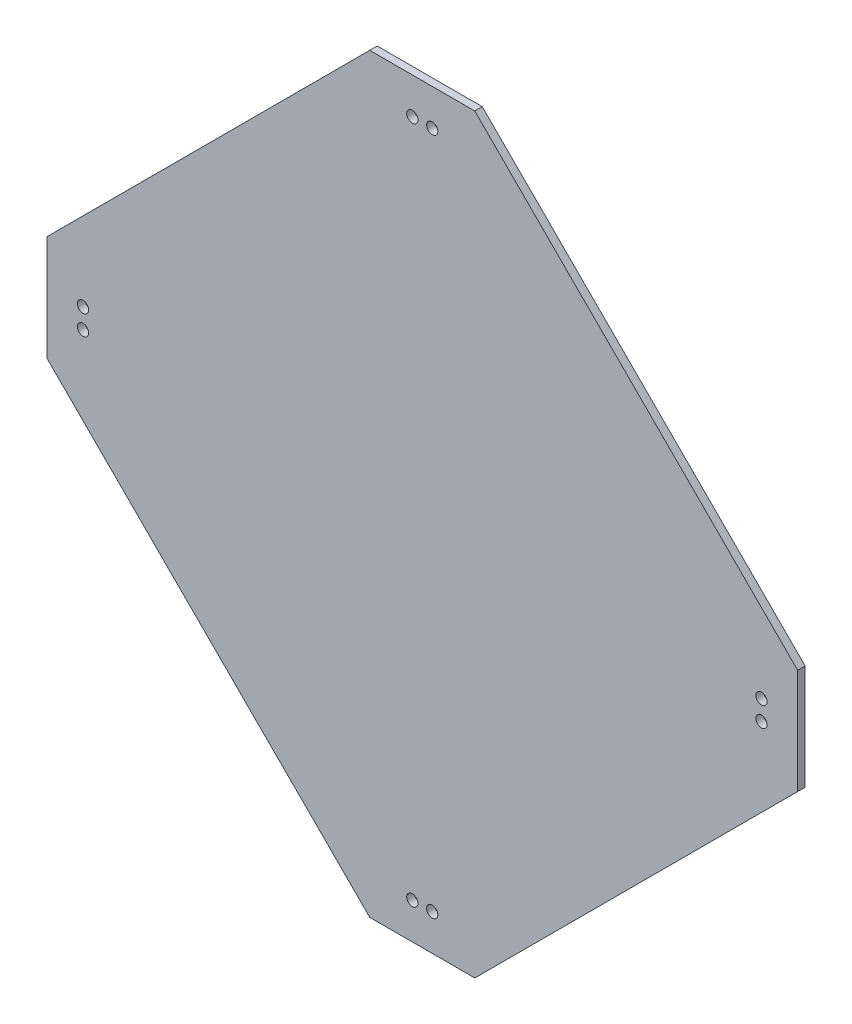
ISO-10303-21;
HEADER;
FILE_DESCRIPTION(('STEP AP214'),'2;1');
FILE_NAME('part.step','',(''),(''),'','','');
FILE_SCHEMA(('AUTOMOTIVE_DESIGN { 1 0 10303 214 1 1 1 1 }'));
ENDSEC;
DATA;
#1=APPLICATION_CONTEXT('core data for automotive mechanical design processes');
#2=APPLICATION_PROTOCOL_DEFINITION('international standard','automotive_design',2000,#1);
#3=PRODUCT_CONTEXT('',#1,'mechanical');
#4=PRODUCT('Part','Part','',(#3));
#5=PRODUCT_RELATED_PRODUCT_CATEGORY('part','',(#4));
#6=PRODUCT_DEFINITION_FORMATION('','',#4);
#7=PRODUCT_DEFINITION_CONTEXT('part definition',#1,'design');
#8=PRODUCT_DEFINITION('design','',#6,#7);
#9=PRODUCT_DEFINITION_SHAPE('','',#8);
#10=(LENGTH_UNIT() NAMED_UNIT(*) SI_UNIT(.MILLI.,.METRE.));
#11=(NAMED_UNIT(*) PLANE_ANGLE_UNIT() SI_UNIT($,.RADIAN.));
#12=(NAMED_UNIT(*) SI_UNIT($,.STERADIAN.) SOLID_ANGLE_UNIT());
#13=UNCERTAINTY_MEASURE_WITH_UNIT(LENGTH_MEASURE(1.E-05),#10,'distance_accuracy_value','');
#14=(GEOMETRIC_REPRESENTATION_CONTEXT(3) GLOBAL_UNCERTAINTY_ASSIGNED_CONTEXT((#13)) GLOBAL_UNIT_ASSIGNED_CONTEXT((#10,
#11,#12)) REPRESENTATION_CONTEXT('',''));
#15=CARTESIAN_POINT('',(0.,0.,0.));
#16=DIRECTION('',(0.,0.,1.));
#17=DIRECTION('',(1.,0.,0.));
#18=AXIS2_PLACEMENT_3D('',#15,#16,#17);
#19=CARTESIAN_POINT('',(0.,0.,3.));
#20=DIRECTION('',(0.,0.,-1.));
#21=DIRECTION('',(-1.,0.,0.));
#22=AXIS2_PLACEMENT_3D('',#19,#20,#21);
#23=PLANE('',#22);
#24=DIRECTION('',(-0.707106781186544,0.707106781186551,0.));
#25=VECTOR('',#24,1.);
#26=CARTESIAN_POINT('',(75.9816589394957,-12.9282003511903,3.));
#27=LINE('',#26,#25);
#28=CARTESIAN_POINT('',(205.297418483575,-142.243959895271,3.));
#29=VERTEX_POINT('',#28);
#30=CARTESIAN_POINT('',(75.9816589394957,-12.9282003511903,3.));
#31=VERTEX_POINT('',#30);
#32=EDGE_CURVE('E173',#29,#31,#27,.T.);
#33=ORIENTED_EDGE('',*,*,#32,.T.);
#34=DIRECTION('',(-1.,0.,0.));
#35=VECTOR('',#34,1.);
#36=CARTESIAN_POINT('',(33.9205491705568,-12.9282003511903,3.));
#37=LINE('',#36,#35);
#38=CARTESIAN_POINT('',(33.9205491705568,-12.9282003511903,3.));
#39=VERTEX_POINT('',#38);
#40=EDGE_CURVE('E80',#31,#39,#37,.T.);
#41=ORIENTED_EDGE('',*,*,#40,.T.);
#42=DIRECTION('',(-0.707106781186551,-0.707106781186544,0.));
#43=VECTOR('',#42,1.);
#44=CARTESIAN_POINT('',(-30.7373306014837,-77.5860801232302,3.));
#45=LINE('',#44,#43);
#46=CARTESIAN_POINT('',(-95.3952103735244,-142.24395989527,3.));
#47=VERTEX_POINT('',#46);
#48=EDGE_CURVE('E125',#39,#47,#45,.T.);
#49=ORIENTED_EDGE('',*,*,#48,.T.);
#50=DIRECTION('',(0.,1.,0.));
#51=VECTOR('',#50,1.);
#52=CARTESIAN_POINT('',(-95.3952103735244,-142.24395989527,3.));
#53=LINE('',#52,#51);
#54=CARTESIAN_POINT('',(-95.3952103735248,-184.305069664209,3.));
#55=VERTEX_POINT('',#54);
#56=EDGE_CURVE('E110',#55,#47,#53,.T.);
#57=ORIENTED_EDGE('',*,*,#56,.F.);
#58=DIRECTION('',(-0.707106781186544,0.707106781186551,0.));
#59=VECTOR('',#58,1.);
#60=CARTESIAN_POINT('',(-95.3952103735248,-184.305069664209,3.));
#61=LINE('',#60,#59);
#62=CARTESIAN_POINT('',(33.9205491705543,-313.620829208289,3.));
#63=VERTEX_POINT('',#62);
#64=EDGE_CURVE('E123',#63,#55,#61,.T.);
#65=ORIENTED_EDGE('',*,*,#64,.F.);
#66=DIRECTION('',(-1.,0.,0.));
#67=VECTOR('',#66,1.);
#68=CARTESIAN_POINT('',(33.9205491705543,-313.620829208289,3.));
#69=LINE('',#68,#67);
#70=CARTESIAN_POINT('',(75.9816589394932,-313.62082920829,3.));
#71=VERTEX_POINT('',#70);
#72=EDGE_CURVE('E127',#71,#63,#69,.T.);
#73=ORIENTED_EDGE('',*,*,#72,.F.);
#74=DIRECTION('',(0.707106781186551,0.707106781186544,0.));
#75=VECTOR('',#74,1.);
#76=CARTESIAN_POINT('',(205.297418483575,-184.305069664209,3.));
#77=LINE('',#76,#75);
#78=CARTESIAN_POINT('',(205.297418483575,-184.305069664209,3.));
#79=VERTEX_POINT('',#78);
#80=EDGE_CURVE('E177',#71,#79,#77,.T.);
#81=ORIENTED_EDGE('',*,*,#80,.T.);
#82=DIRECTION('',(0.,1.,0.));
#83=VECTOR('',#82,1.);
#84=CARTESIAN_POINT('',(205.297418483575,-142.243959895271,3.));
#85=LINE('',#84,#83);
#86=EDGE_CURVE('E49',#79,#29,#85,.T.);
#87=ORIENTED_EDGE('',*,*,#86,.T.);
#88=EDGE_LOOP('',(#33,#41,#49,#57,#65,#73,#81,#87));
#89=FACE_BOUND('',#88,.T.);
#90=CARTESIAN_POINT('',(50.9711543065999,-27.4282003511903,3.));
#91=DIRECTION('',(0.,0.,1.));
#92=DIRECTION('',(1.,0.,0.));
#93=AXIS2_PLACEMENT_3D('',#90,#91,#92);
#94=CIRCLE('',#93,2.25);
#95=CARTESIAN_POINT('',(53.2211543065999,-27.4282003511903,3.));
#96=VERTEX_POINT('',#95);
#97=EDGE_CURVE('E167',#96,#96,#94,.T.);
#98=ORIENTED_EDGE('',*,*,#97,.F.);
#99=EDGE_LOOP('',(#98));
#100=FACE_BOUND('',#99,.T.);
#101=CARTESIAN_POINT('',(58.9310538034528,-27.4282003511903,3.));
#102=DIRECTION('',(0.,0.,1.));
#103=DIRECTION('',(1.,0.,0.));
#104=AXIS2_PLACEMENT_3D('',#101,#102,#103);
#105=CIRCLE('',#104,2.25);
#106=CARTESIAN_POINT('',(61.1810538034528,-27.4282003511903,3.));
#107=VERTEX_POINT('',#106);
#108=EDGE_CURVE('E161',#107,#107,#105,.T.);
#109=ORIENTED_EDGE('',*,*,#108,.F.);
#110=EDGE_LOOP('',(#109));
#111=FACE_BOUND('',#110,.T.);
#112=CARTESIAN_POINT('',(190.797418483575,-167.254464528167,3.));
#113=DIRECTION('',(0.,0.,1.));
#114=DIRECTION('',(1.,0.,0.));
#115=AXIS2_PLACEMENT_3D('',#112,#113,#114);
#116=CIRCLE('',#115,2.25000000000001);
#117=CARTESIAN_POINT('',(193.047418483575,-167.254464528167,3.));
#118=VERTEX_POINT('',#117);
#119=EDGE_CURVE('E155',#118,#118,#116,.T.);
#120=ORIENTED_EDGE('',*,*,#119,.F.);
#121=EDGE_LOOP('',(#120));
#122=FACE_BOUND('',#121,.T.);
#123=CARTESIAN_POINT('',(190.797418483575,-159.294565031314,3.));
#124=DIRECTION('',(0.,0.,1.));
#125=DIRECTION('',(1.,0.,0.));
#126=AXIS2_PLACEMENT_3D('',#123,#124,#125);
#127=CIRCLE('',#126,2.25000000000001);
#128=CARTESIAN_POINT('',(193.047418483575,-159.294565031314,3.));
#129=VERTEX_POINT('',#128);
#130=EDGE_CURVE('E149',#129,#129,#127,.T.);
#131=ORIENTED_EDGE('',*,*,#130,.F.);
#132=EDGE_LOOP('',(#131));
#133=FACE_BOUND('',#132,.T.);
#134=CARTESIAN_POINT('',(-80.8952103735245,-159.294565031313,3.));
#135=DIRECTION('',(0.,0.,-1.));
#136=DIRECTION('',(0.,-1.,0.));
#137=AXIS2_PLACEMENT_3D('',#134,#135,#136);
#138=CIRCLE('',#137,2.25);
#139=CARTESIAN_POINT('',(-80.8952103735246,-161.544565031313,3.));
#140=VERTEX_POINT('',#139);
#141=EDGE_CURVE('E143',#140,#140,#138,.T.);
#142=ORIENTED_EDGE('',*,*,#141,.T.);
#143=EDGE_LOOP('',(#142));
#144=FACE_BOUND('',#143,.T.);
#145=CARTESIAN_POINT('',(-80.8952103735246,-167.254464528166,3.));
#146=DIRECTION('',(0.,0.,-1.));
#147=DIRECTION('',(0.,-1.,0.));
#148=AXIS2_PLACEMENT_3D('',#145,#146,#147);
#149=CIRCLE('',#148,2.25);
#150=CARTESIAN_POINT('',(-80.8952103735246,-169.504464528166,3.));
#151=VERTEX_POINT('',#150);
#152=EDGE_CURVE('E398',#151,#151,#149,.T.);
#153=ORIENTED_EDGE('',*,*,#152,.T.);
#154=EDGE_LOOP('',(#153));
#155=FACE_BOUND('',#154,.T.);
#156=CARTESIAN_POINT('',(58.9310538034504,-299.12082920829,3.));
#157=DIRECTION('',(0.,0.,-1.));
#158=DIRECTION('',(0.,-1.,0.));
#159=AXIS2_PLACEMENT_3D('',#156,#157,#158);
#160=CIRCLE('',#159,2.25000000000001);
#161=CARTESIAN_POINT('',(58.9310538034504,-301.37082920829,3.));
#162=VERTEX_POINT('',#161);
#163=EDGE_CURVE('E392',#162,#162,#160,.T.);
#164=ORIENTED_EDGE('',*,*,#163,.T.);
#165=EDGE_LOOP('',(#164));
#166=FACE_BOUND('',#165,.T.);
#167=CARTESIAN_POINT('',(50.9711543065975,-299.12082920829,3.));
#168=DIRECTION('',(0.,0.,-1.));
#169=DIRECTION('',(0.,-1.,0.));
#170=AXIS2_PLACEMENT_3D('',#167,#168,#169);
#171=CIRCLE('',#170,2.25000000000001);
#172=CARTESIAN_POINT('',(50.9711543065975,-301.37082920829,3.));
#173=VERTEX_POINT('',#172);
#174=EDGE_CURVE('E383',#173,#173,#171,.T.);
#175=ORIENTED_EDGE('',*,*,#174,.T.);
#176=EDGE_LOOP('',(#175));
#177=FACE_BOUND('',#176,.T.);
#178=ADVANCED_FACE('F32',(#89,#100,#111,#122,#133,#144,#155,#166,#177),#23,.F.);
#179=CARTESIAN_POINT('',(0.,0.,0.));
#180=DIRECTION('',(0.,0.,-1.));
#181=DIRECTION('',(-1.,0.,0.));
#182=AXIS2_PLACEMENT_3D('',#179,#180,#181);
#183=PLANE('',#182);
#184=CARTESIAN_POINT('',(190.797418483575,-167.254464528167,0.));
#185=DIRECTION('',(0.,0.,1.));
#186=DIRECTION('',(1.,0.,0.));
#187=AXIS2_PLACEMENT_3D('',#184,#185,#186);
#188=CIRCLE('',#187,2.25000000000001);
#189=CARTESIAN_POINT('',(193.047418483575,-167.254464528167,0.));
#190=VERTEX_POINT('',#189);
#191=EDGE_CURVE('E152',#190,#190,#188,.T.);
#192=ORIENTED_EDGE('',*,*,#191,.T.);
#193=EDGE_LOOP('',(#192));
#194=FACE_BOUND('',#193,.T.);
#195=CARTESIAN_POINT('',(50.9711543065999,-27.4282003511903,0.));
#196=DIRECTION('',(0.,0.,1.));
#197=DIRECTION('',(1.,0.,0.));
#198=AXIS2_PLACEMENT_3D('',#195,#196,#197);
#199=CIRCLE('',#198,2.25);
#200=CARTESIAN_POINT('',(53.2211543065999,-27.4282003511903,0.));
#201=VERTEX_POINT('',#200);
#202=EDGE_CURVE('E164',#201,#201,#199,.T.);
#203=ORIENTED_EDGE('',*,*,#202,.T.);
#204=EDGE_LOOP('',(#203));
#205=FACE_BOUND('',#204,.T.);
#206=DIRECTION('',(-0.707106781186544,0.707106781186551,0.));
#207=VECTOR('',#206,1.);
#208=CARTESIAN_POINT('',(75.9816589394957,-12.9282003511903,0.));
#209=LINE('',#208,#207);
#210=CARTESIAN_POINT('',(205.297418483575,-142.243959895271,0.));
#211=VERTEX_POINT('',#210);
#212=CARTESIAN_POINT('',(75.9816589394957,-12.9282003511903,0.));
#213=VERTEX_POINT('',#212);
#214=EDGE_CURVE('E170',#211,#213,#209,.T.);
#215=ORIENTED_EDGE('',*,*,#214,.F.);
#216=DIRECTION('',(0.,1.,0.));
#217=VECTOR('',#216,1.);
#218=CARTESIAN_POINT('',(205.297418483575,-142.243959895271,0.));
#219=LINE('',#218,#217);
#220=CARTESIAN_POINT('',(205.297418483575,-184.305069664209,0.));
#221=VERTEX_POINT('',#220);
#222=EDGE_CURVE('E73',#221,#211,#219,.T.);
#223=ORIENTED_EDGE('',*,*,#222,.F.);
#224=DIRECTION('',(0.707106781186551,0.707106781186544,0.));
#225=VECTOR('',#224,1.);
#226=CARTESIAN_POINT('',(205.297418483575,-184.305069664209,0.));
#227=LINE('',#226,#225);
#228=CARTESIAN_POINT('',(75.9816589394932,-313.62082920829,0.));
#229=VERTEX_POINT('',#228);
#230=EDGE_CURVE('E67',#229,#221,#227,.T.);
#231=ORIENTED_EDGE('',*,*,#230,.F.);
#232=DIRECTION('',(-1.,0.,0.));
#233=VECTOR('',#232,1.);
#234=CARTESIAN_POINT('',(33.9205491705543,-313.620829208289,0.));
#235=LINE('',#234,#233);
#236=CARTESIAN_POINT('',(33.9205491705543,-313.620829208289,0.));
#237=VERTEX_POINT('',#236);
#238=EDGE_CURVE('E132',#229,#237,#235,.T.);
#239=ORIENTED_EDGE('',*,*,#238,.T.);
#240=DIRECTION('',(-0.707106781186544,0.707106781186551,0.));
#241=VECTOR('',#240,1.);
#242=CARTESIAN_POINT('',(-95.3952103735248,-184.305069664209,0.));
#243=LINE('',#242,#241);
#244=CARTESIAN_POINT('',(-95.3952103735248,-184.305069664209,0.));
#245=VERTEX_POINT('',#244);
#246=EDGE_CURVE('E141',#237,#245,#243,.T.);
#247=ORIENTED_EDGE('',*,*,#246,.T.);
#248=DIRECTION('',(0.,1.,0.));
#249=VECTOR('',#248,1.);
#250=CARTESIAN_POINT('',(-95.3952103735244,-142.24395989527,0.));
#251=LINE('',#250,#249);
#252=CARTESIAN_POINT('',(-95.3952103735244,-142.24395989527,0.));
#253=VERTEX_POINT('',#252);
#254=EDGE_CURVE('E112',#245,#253,#251,.T.);
#255=ORIENTED_EDGE('',*,*,#254,.T.);
#256=DIRECTION('',(-0.707106781186551,-0.707106781186544,0.));
#257=VECTOR('',#256,1.);
#258=CARTESIAN_POINT('',(-30.7373306014837,-77.5860801232302,0.));
#259=LINE('',#258,#257);
#260=CARTESIAN_POINT('',(33.9205491705568,-12.9282003511903,0.));
#261=VERTEX_POINT('',#260);
#262=EDGE_CURVE('E185',#261,#253,#259,.T.);
#263=ORIENTED_EDGE('',*,*,#262,.F.);
#264=DIRECTION('',(-1.,0.,0.));
#265=VECTOR('',#264,1.);
#266=CARTESIAN_POINT('',(33.9205491705568,-12.9282003511903,0.));
#267=LINE('',#266,#265);
#268=EDGE_CURVE('E183',#213,#261,#267,.T.);
#269=ORIENTED_EDGE('',*,*,#268,.F.);
#270=EDGE_LOOP('',(#215,#223,#231,#239,#247,#255,#263,#269));
#271=FACE_BOUND('',#270,.T.);
#272=CARTESIAN_POINT('',(58.9310538034528,-27.4282003511903,0.));
#273=DIRECTION('',(0.,0.,1.));
#274=DIRECTION('',(1.,0.,0.));
#275=AXIS2_PLACEMENT_3D('',#272,#273,#274);
#276=CIRCLE('',#275,2.25);
#277=CARTESIAN_POINT('',(61.1810538034528,-27.4282003511903,0.));
#278=VERTEX_POINT('',#277);
#279=EDGE_CURVE('E158',#278,#278,#276,.T.);
#280=ORIENTED_EDGE('',*,*,#279,.T.);
#281=EDGE_LOOP('',(#280));
#282=FACE_BOUND('',#281,.T.);
#283=CARTESIAN_POINT('',(190.797418483575,-159.294565031314,0.));
#284=DIRECTION('',(0.,0.,1.));
#285=DIRECTION('',(1.,0.,0.));
#286=AXIS2_PLACEMENT_3D('',#283,#284,#285);
#287=CIRCLE('',#286,2.25000000000001);
#288=CARTESIAN_POINT('',(193.047418483575,-159.294565031314,0.));
#289=VERTEX_POINT('',#288);
#290=EDGE_CURVE('E117',#289,#289,#287,.T.);
#291=ORIENTED_EDGE('',*,*,#290,.T.);
#292=EDGE_LOOP('',(#291));
#293=FACE_BOUND('',#292,.T.);
#294=CARTESIAN_POINT('',(58.9310538034504,-299.12082920829,0.));
#295=DIRECTION('',(0.,0.,-1.));
#296=DIRECTION('',(0.,-1.,0.));
#297=AXIS2_PLACEMENT_3D('',#294,#295,#296);
#298=CIRCLE('',#297,2.25000000000001);
#299=CARTESIAN_POINT('',(58.9310538034504,-301.37082920829,0.));
#300=VERTEX_POINT('',#299);
#301=EDGE_CURVE('E389',#300,#300,#298,.T.);
#302=ORIENTED_EDGE('',*,*,#301,.F.);
#303=EDGE_LOOP('',(#302));
#304=FACE_BOUND('',#303,.T.);
#305=CARTESIAN_POINT('',(-80.8952103735245,-159.294565031313,0.));
#306=DIRECTION('',(0.,0.,-1.));
#307=DIRECTION('',(0.,-1.,0.));
#308=AXIS2_PLACEMENT_3D('',#305,#306,#307);
#309=CIRCLE('',#308,2.25);
#310=CARTESIAN_POINT('',(-80.8952103735246,-161.544565031313,0.));
#311=VERTEX_POINT('',#310);
#312=EDGE_CURVE('E137',#311,#311,#309,.T.);
#313=ORIENTED_EDGE('',*,*,#312,.F.);
#314=EDGE_LOOP('',(#313));
#315=FACE_BOUND('',#314,.T.);
#316=CARTESIAN_POINT('',(-80.8952103735246,-167.254464528166,0.));
#317=DIRECTION('',(0.,0.,-1.));
#318=DIRECTION('',(0.,-1.,0.));
#319=AXIS2_PLACEMENT_3D('',#316,#317,#318);
#320=CIRCLE('',#319,2.25);
#321=CARTESIAN_POINT('',(-80.8952103735246,-169.504464528166,0.));
#322=VERTEX_POINT('',#321);
#323=EDGE_CURVE('E395',#322,#322,#320,.T.);
#324=ORIENTED_EDGE('',*,*,#323,.F.);
#325=EDGE_LOOP('',(#324));
#326=FACE_BOUND('',#325,.T.);
#327=CARTESIAN_POINT('',(50.9711543065975,-299.12082920829,0.));
#328=DIRECTION('',(0.,0.,-1.));
#329=DIRECTION('',(0.,-1.,0.));
#330=AXIS2_PLACEMENT_3D('',#327,#328,#329);
#331=CIRCLE('',#330,2.25000000000001);
#332=CARTESIAN_POINT('',(50.9711543065975,-301.37082920829,0.));
#333=VERTEX_POINT('',#332);
#334=EDGE_CURVE('E386',#333,#333,#331,.T.);
#335=ORIENTED_EDGE('',*,*,#334,.F.);
#336=EDGE_LOOP('',(#335));
#337=FACE_BOUND('',#336,.T.);
#338=ADVANCED_FACE('F197',(#194,#205,#271,#282,#293,#304,#315,#326,#337),#183,.T.);
#339=CARTESIAN_POINT('',(75.9816589394957,-12.9282003511903,3.));
#340=DIRECTION('',(-0.707106781186551,-0.707106781186544,0.));
#341=DIRECTION('',(0.707106781186544,-0.707106781186551,0.));
#342=AXIS2_PLACEMENT_3D('',#339,#340,#341);
#343=PLANE('',#342);
#344=ORIENTED_EDGE('',*,*,#214,.T.);
#345=DIRECTION('',(0.,0.,-1.));
#346=VECTOR('',#345,1.);
#347=CARTESIAN_POINT('',(75.9816589394957,-12.9282003511903,3.));
#348=LINE('',#347,#346);
#349=EDGE_CURVE('E11',#31,#213,#348,.T.);
#350=ORIENTED_EDGE('',*,*,#349,.F.);
#351=ORIENTED_EDGE('',*,*,#32,.F.);
#352=DIRECTION('',(0.,0.,-1.));
#353=VECTOR('',#352,1.);
#354=CARTESIAN_POINT('',(205.297418483575,-142.243959895271,3.));
#355=LINE('',#354,#353);
#356=EDGE_CURVE('E180',#29,#211,#355,.T.);
#357=ORIENTED_EDGE('',*,*,#356,.T.);
#358=EDGE_LOOP('',(#344,#350,#351,#357));
#359=FACE_BOUND('',#358,.T.);
#360=ADVANCED_FACE('F34',(#359),#343,.F.);
#361=CARTESIAN_POINT('',(33.9205491705568,-12.9282003511903,3.));
#362=DIRECTION('',(0.,-1.,0.));
#363=DIRECTION('',(0.,0.,-1.));
#364=AXIS2_PLACEMENT_3D('',#361,#362,#363);
#365=PLANE('',#364);
#366=ORIENTED_EDGE('',*,*,#268,.T.);
#367=DIRECTION('',(0.,0.,-1.));
#368=VECTOR('',#367,1.);
#369=CARTESIAN_POINT('',(33.9205491705568,-12.9282003511903,3.));
#370=LINE('',#369,#368);
#371=EDGE_CURVE('E41',#39,#261,#370,.T.);
#372=ORIENTED_EDGE('',*,*,#371,.F.);
#373=ORIENTED_EDGE('',*,*,#40,.F.);
#374=ORIENTED_EDGE('',*,*,#349,.T.);
#375=EDGE_LOOP('',(#366,#372,#373,#374));
#376=FACE_BOUND('',#375,.T.);
#377=ADVANCED_FACE('F208',(#376),#365,.F.);
#378=CARTESIAN_POINT('',(-30.7373306014837,-77.5860801232302,3.));
#379=DIRECTION('',(0.707106781186544,-0.707106781186551,0.));
#380=DIRECTION('',(0.707106781186551,0.707106781186544,0.));
#381=AXIS2_PLACEMENT_3D('',#378,#379,#380);
#382=PLANE('',#381);
#383=ORIENTED_EDGE('',*,*,#262,.T.);
#384=DIRECTION('',(0.,0.,-1.));
#385=VECTOR('',#384,1.);
#386=CARTESIAN_POINT('',(-95.3952103735244,-142.24395989527,3.));
#387=LINE('',#386,#385);
#388=EDGE_CURVE('E118',#47,#253,#387,.T.);
#389=ORIENTED_EDGE('',*,*,#388,.F.);
#390=ORIENTED_EDGE('',*,*,#48,.F.);
#391=ORIENTED_EDGE('',*,*,#371,.T.);
#392=EDGE_LOOP('',(#383,#389,#390,#391));
#393=FACE_BOUND('',#392,.T.);
#394=ADVANCED_FACE('F194',(#393),#382,.F.);
#395=CARTESIAN_POINT('',(205.297418483575,-184.305069664209,3.));
#396=DIRECTION('',(-0.707106781186544,0.707106781186551,0.));
#397=DIRECTION('',(-0.707106781186551,-0.707106781186544,0.));
#398=AXIS2_PLACEMENT_3D('',#395,#396,#397);
#399=PLANE('',#398);
#400=ORIENTED_EDGE('',*,*,#230,.T.);
#401=DIRECTION('',(0.,0.,-1.));
#402=VECTOR('',#401,1.);
#403=CARTESIAN_POINT('',(205.297418483575,-184.305069664209,3.));
#404=LINE('',#403,#402);
#405=EDGE_CURVE('E190',#79,#221,#404,.T.);
#406=ORIENTED_EDGE('',*,*,#405,.F.);
#407=ORIENTED_EDGE('',*,*,#80,.F.);
#408=DIRECTION('',(0.,0.,-1.));
#409=VECTOR('',#408,1.);
#410=CARTESIAN_POINT('',(75.9816589394932,-313.62082920829,3.));
#411=LINE('',#410,#409);
#412=EDGE_CURVE('E146',#71,#229,#411,.T.);
#413=ORIENTED_EDGE('',*,*,#412,.T.);
#414=EDGE_LOOP('',(#400,#406,#407,#413));
#415=FACE_BOUND('',#414,.T.);
#416=ADVANCED_FACE('F203',(#415),#399,.F.);
#417=CARTESIAN_POINT('',(205.297418483575,-142.243959895271,3.));
#418=DIRECTION('',(-1.,0.,0.));
#419=DIRECTION('',(0.,0.,1.));
#420=AXIS2_PLACEMENT_3D('',#417,#418,#419);
#421=PLANE('',#420);
#422=ORIENTED_EDGE('',*,*,#222,.T.);
#423=ORIENTED_EDGE('',*,*,#356,.F.);
#424=ORIENTED_EDGE('',*,*,#86,.F.);
#425=ORIENTED_EDGE('',*,*,#405,.T.);
#426=EDGE_LOOP('',(#422,#423,#424,#425));
#427=FACE_BOUND('',#426,.T.);
#428=ADVANCED_FACE('F204',(#427),#421,.F.);
#429=CARTESIAN_POINT('',(50.9711543065999,-27.4282003511903,3.));
#430=DIRECTION('',(0.,0.,-1.));
#431=DIRECTION('',(-1.,0.,0.));
#432=AXIS2_PLACEMENT_3D('',#429,#430,#431);
#433=CYLINDRICAL_SURFACE('',#432,2.25);
#434=ORIENTED_EDGE('',*,*,#97,.T.);
#435=EDGE_LOOP('',(#434));
#436=FACE_BOUND('',#435,.T.);
#437=ORIENTED_EDGE('',*,*,#202,.F.);
#438=EDGE_LOOP('',(#437));
#439=FACE_BOUND('',#438,.T.);
#440=ADVANCED_FACE('F223',(#436,#439),#433,.F.);
#441=CARTESIAN_POINT('',(58.9310538034528,-27.4282003511903,3.));
#442=DIRECTION('',(0.,0.,-1.));
#443=DIRECTION('',(-1.,0.,0.));
#444=AXIS2_PLACEMENT_3D('',#441,#442,#443);
#445=CYLINDRICAL_SURFACE('',#444,2.25);
#446=ORIENTED_EDGE('',*,*,#108,.T.);
#447=EDGE_LOOP('',(#446));
#448=FACE_BOUND('',#447,.T.);
#449=ORIENTED_EDGE('',*,*,#279,.F.);
#450=EDGE_LOOP('',(#449));
#451=FACE_BOUND('',#450,.T.);
#452=ADVANCED_FACE('F245',(#448,#451),#445,.F.);
#453=CARTESIAN_POINT('',(190.797418483575,-167.254464528167,3.));
#454=DIRECTION('',(0.,0.,-1.));
#455=DIRECTION('',(-1.,0.,0.));
#456=AXIS2_PLACEMENT_3D('',#453,#454,#455);
#457=CYLINDRICAL_SURFACE('',#456,2.25000000000001);
#458=ORIENTED_EDGE('',*,*,#119,.T.);
#459=EDGE_LOOP('',(#458));
#460=FACE_BOUND('',#459,.T.);
#461=ORIENTED_EDGE('',*,*,#191,.F.);
#462=EDGE_LOOP('',(#461));
#463=FACE_BOUND('',#462,.T.);
#464=ADVANCED_FACE('F254',(#460,#463),#457,.F.);
#465=CARTESIAN_POINT('',(190.797418483575,-159.294565031314,3.));
#466=DIRECTION('',(0.,0.,-1.));
#467=DIRECTION('',(-1.,0.,0.));
#468=AXIS2_PLACEMENT_3D('',#465,#466,#467);
#469=CYLINDRICAL_SURFACE('',#468,2.25000000000001);
#470=ORIENTED_EDGE('',*,*,#130,.T.);
#471=EDGE_LOOP('',(#470));
#472=FACE_BOUND('',#471,.T.);
#473=ORIENTED_EDGE('',*,*,#290,.F.);
#474=EDGE_LOOP('',(#473));
#475=FACE_BOUND('',#474,.T.);
#476=ADVANCED_FACE('F263',(#472,#475),#469,.F.);
#477=CARTESIAN_POINT('',(-95.3952103735248,-184.305069664209,3.));
#478=DIRECTION('',(0.707106781186551,0.707106781186544,0.));
#479=DIRECTION('',(0.707106781186544,-0.707106781186551,0.));
#480=AXIS2_PLACEMENT_3D('',#477,#478,#479);
#481=PLANE('',#480);
#482=ORIENTED_EDGE('',*,*,#246,.F.);
#483=DIRECTION('',(0.,0.,-1.));
#484=VECTOR('',#483,1.);
#485=CARTESIAN_POINT('',(33.9205491705543,-313.620829208289,3.));
#486=LINE('',#485,#484);
#487=EDGE_CURVE('E130',#63,#237,#486,.T.);
#488=ORIENTED_EDGE('',*,*,#487,.F.);
#489=ORIENTED_EDGE('',*,*,#64,.T.);
#490=DIRECTION('',(0.,0.,-1.));
#491=VECTOR('',#490,1.);
#492=CARTESIAN_POINT('',(-95.3952103735248,-184.305069664209,3.));
#493=LINE('',#492,#491);
#494=EDGE_CURVE('E106',#55,#245,#493,.T.);
#495=ORIENTED_EDGE('',*,*,#494,.T.);
#496=EDGE_LOOP('',(#482,#488,#489,#495));
#497=FACE_BOUND('',#496,.T.);
#498=ADVANCED_FACE('F129',(#497),#481,.F.);
#499=CARTESIAN_POINT('',(-95.3952103735244,-142.24395989527,3.));
#500=DIRECTION('',(1.,0.,0.));
#501=DIRECTION('',(0.,0.,-1.));
#502=AXIS2_PLACEMENT_3D('',#499,#500,#501);
#503=PLANE('',#502);
#504=ORIENTED_EDGE('',*,*,#254,.F.);
#505=ORIENTED_EDGE('',*,*,#494,.F.);
#506=ORIENTED_EDGE('',*,*,#56,.T.);
#507=ORIENTED_EDGE('',*,*,#388,.T.);
#508=EDGE_LOOP('',(#504,#505,#506,#507));
#509=FACE_BOUND('',#508,.T.);
#510=ADVANCED_FACE('F108',(#509),#503,.F.);
#511=CARTESIAN_POINT('',(33.9205491705543,-313.620829208289,3.));
#512=DIRECTION('',(0.,1.,0.));
#513=DIRECTION('',(0.,0.,1.));
#514=AXIS2_PLACEMENT_3D('',#511,#512,#513);
#515=PLANE('',#514);
#516=ORIENTED_EDGE('',*,*,#238,.F.);
#517=ORIENTED_EDGE('',*,*,#412,.F.);
#518=ORIENTED_EDGE('',*,*,#72,.T.);
#519=ORIENTED_EDGE('',*,*,#487,.T.);
#520=EDGE_LOOP('',(#516,#517,#518,#519));
#521=FACE_BOUND('',#520,.T.);
#522=ADVANCED_FACE('F202',(#521),#515,.F.);
#523=CARTESIAN_POINT('',(-80.8952103735245,-159.294565031313,3.));
#524=DIRECTION('',(0.,0.,-1.));
#525=DIRECTION('',(0.,1.,0.));
#526=AXIS2_PLACEMENT_3D('',#523,#524,#525);
#527=CYLINDRICAL_SURFACE('',#526,2.25);
#528=ORIENTED_EDGE('',*,*,#141,.F.);
#529=EDGE_LOOP('',(#528));
#530=FACE_BOUND('',#529,.T.);
#531=ORIENTED_EDGE('',*,*,#312,.T.);
#532=EDGE_LOOP('',(#531));
#533=FACE_BOUND('',#532,.T.);
#534=ADVANCED_FACE('F292',(#530,#533),#527,.F.);
#535=CARTESIAN_POINT('',(-80.8952103735246,-167.254464528166,3.));
#536=DIRECTION('',(0.,0.,-1.));
#537=DIRECTION('',(0.,1.,0.));
#538=AXIS2_PLACEMENT_3D('',#535,#536,#537);
#539=CYLINDRICAL_SURFACE('',#538,2.25);
#540=ORIENTED_EDGE('',*,*,#152,.F.);
#541=EDGE_LOOP('',(#540));
#542=FACE_BOUND('',#541,.T.);
#543=ORIENTED_EDGE('',*,*,#323,.T.);
#544=EDGE_LOOP('',(#543));
#545=FACE_BOUND('',#544,.T.);
#546=ADVANCED_FACE('F299',(#542,#545),#539,.F.);
#547=CARTESIAN_POINT('',(58.9310538034504,-299.12082920829,3.));
#548=DIRECTION('',(0.,0.,-1.));
#549=DIRECTION('',(0.,1.,0.));
#550=AXIS2_PLACEMENT_3D('',#547,#548,#549);
#551=CYLINDRICAL_SURFACE('',#550,2.25000000000001);
#552=ORIENTED_EDGE('',*,*,#163,.F.);
#553=EDGE_LOOP('',(#552));
#554=FACE_BOUND('',#553,.T.);
#555=ORIENTED_EDGE('',*,*,#301,.T.);
#556=EDGE_LOOP('',(#555));
#557=FACE_BOUND('',#556,.T.);
#558=ADVANCED_FACE('F307',(#554,#557),#551,.F.);
#559=CARTESIAN_POINT('',(50.9711543065975,-299.12082920829,3.));
#560=DIRECTION('',(0.,0.,-1.));
#561=DIRECTION('',(0.,1.,0.));
#562=AXIS2_PLACEMENT_3D('',#559,#560,#561);
#563=CYLINDRICAL_SURFACE('',#562,2.25000000000001);
#564=ORIENTED_EDGE('',*,*,#174,.F.);
#565=EDGE_LOOP('',(#564));
#566=FACE_BOUND('',#565,.T.);
#567=ORIENTED_EDGE('',*,*,#334,.T.);
#568=EDGE_LOOP('',(#567));
#569=FACE_BOUND('',#568,.T.);
#570=ADVANCED_FACE('F315',(#566,#569),#563,.F.);
#571=CLOSED_SHELL('',(#178,#338,#360,#377,#394,#416,#428,#440,#452,#464,#476,#498,#510,#522,
#534,#546,#558,#570));
#572=MANIFOLD_SOLID_BREP('B2',#571);
#573=ADVANCED_BREP_SHAPE_REPRESENTATION('',(#18,#572),#14);
#574=SHAPE_DEFINITION_REPRESENTATION(#9,#573);
ENDSEC;
END-ISO-10303-21;
